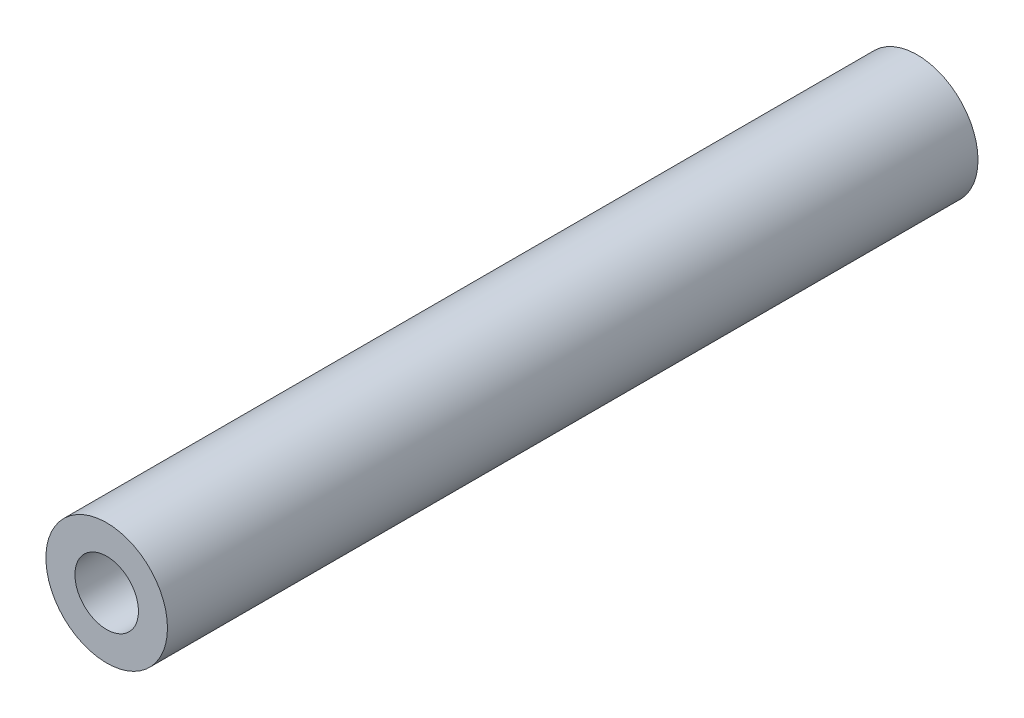
ISO-10303-21;
HEADER;
FILE_DESCRIPTION(('STEP AP214'),'2;1');
FILE_NAME('part.step','',(''),(''),'','','');
FILE_SCHEMA(('AUTOMOTIVE_DESIGN { 1 0 10303 214 1 1 1 1 }'));
ENDSEC;
DATA;
#1=APPLICATION_CONTEXT('core data for automotive mechanical design processes');
#2=APPLICATION_PROTOCOL_DEFINITION('international standard','automotive_design',2000,#1);
#3=PRODUCT_CONTEXT('',#1,'mechanical');
#4=PRODUCT('Part','Part','',(#3));
#5=PRODUCT_RELATED_PRODUCT_CATEGORY('part','',(#4));
#6=PRODUCT_DEFINITION_FORMATION('','',#4);
#7=PRODUCT_DEFINITION_CONTEXT('part definition',#1,'design');
#8=PRODUCT_DEFINITION('design','',#6,#7);
#9=PRODUCT_DEFINITION_SHAPE('','',#8);
#10=(LENGTH_UNIT() NAMED_UNIT(*) SI_UNIT(.MILLI.,.METRE.));
#11=(NAMED_UNIT(*) PLANE_ANGLE_UNIT() SI_UNIT($,.RADIAN.));
#12=(NAMED_UNIT(*) SI_UNIT($,.STERADIAN.) SOLID_ANGLE_UNIT());
#13=UNCERTAINTY_MEASURE_WITH_UNIT(LENGTH_MEASURE(1.E-05),#10,'distance_accuracy_value','');
#14=(GEOMETRIC_REPRESENTATION_CONTEXT(3) GLOBAL_UNCERTAINTY_ASSIGNED_CONTEXT((#13)) GLOBAL_UNIT_ASSIGNED_CONTEXT((#10,
#11,#12)) REPRESENTATION_CONTEXT('',''));
#15=CARTESIAN_POINT('',(0.,0.,0.));
#16=DIRECTION('',(0.,0.,1.));
#17=DIRECTION('',(1.,0.,0.));
#18=AXIS2_PLACEMENT_3D('',#15,#16,#17);
#19=CARTESIAN_POINT('',(0.,0.,31.75));
#20=DIRECTION('',(0.,0.,1.));
#21=DIRECTION('',(1.,0.,0.));
#22=AXIS2_PLACEMENT_3D('',#19,#20,#21);
#23=PLANE('',#22);
#24=CARTESIAN_POINT('',(0.,0.,31.75));
#25=DIRECTION('',(0.,0.,1.));
#26=DIRECTION('',(1.,0.,0.));
#27=AXIS2_PLACEMENT_3D('',#24,#25,#26);
#28=CIRCLE('',#27,4.7625);
#29=CARTESIAN_POINT('',(4.7625,0.,31.75));
#30=VERTEX_POINT('',#29);
#31=EDGE_CURVE('E11',#30,#30,#28,.T.);
#32=ORIENTED_EDGE('',*,*,#31,.T.);
#33=EDGE_LOOP('',(#32));
#34=FACE_BOUND('',#33,.T.);
#35=CARTESIAN_POINT('',(0.,0.,31.75));
#36=DIRECTION('',(0.,0.,1.));
#37=DIRECTION('',(1.,0.,0.));
#38=AXIS2_PLACEMENT_3D('',#35,#36,#37);
#39=CIRCLE('',#38,2.4892);
#40=CARTESIAN_POINT('',(2.4892,0.,31.75));
#41=VERTEX_POINT('',#40);
#42=EDGE_CURVE('E62',#41,#41,#39,.T.);
#43=ORIENTED_EDGE('',*,*,#42,.F.);
#44=EDGE_LOOP('',(#43));
#45=FACE_BOUND('',#44,.T.);
#46=ADVANCED_FACE('F49',(#34,#45),#23,.T.);
#47=CARTESIAN_POINT('',(0.,0.,-31.75));
#48=DIRECTION('',(0.,0.,1.));
#49=DIRECTION('',(1.,0.,0.));
#50=AXIS2_PLACEMENT_3D('',#47,#48,#49);
#51=PLANE('',#50);
#52=CARTESIAN_POINT('',(0.,0.,-31.75));
#53=DIRECTION('',(0.,0.,1.));
#54=DIRECTION('',(1.,0.,0.));
#55=AXIS2_PLACEMENT_3D('',#52,#53,#54);
#56=CIRCLE('',#55,4.7625);
#57=CARTESIAN_POINT('',(4.7625,0.,-31.75));
#58=VERTEX_POINT('',#57);
#59=EDGE_CURVE('E53',#58,#58,#56,.T.);
#60=ORIENTED_EDGE('',*,*,#59,.F.);
#61=EDGE_LOOP('',(#60));
#62=FACE_BOUND('',#61,.T.);
#63=CARTESIAN_POINT('',(0.,0.,-31.75));
#64=DIRECTION('',(0.,0.,1.));
#65=DIRECTION('',(1.,0.,0.));
#66=AXIS2_PLACEMENT_3D('',#63,#64,#65);
#67=CIRCLE('',#66,2.4892);
#68=CARTESIAN_POINT('',(2.4892,0.,-31.75));
#69=VERTEX_POINT('',#68);
#70=EDGE_CURVE('E64',#69,#69,#67,.T.);
#71=ORIENTED_EDGE('',*,*,#70,.T.);
#72=EDGE_LOOP('',(#71));
#73=FACE_BOUND('',#72,.T.);
#74=ADVANCED_FACE('F76',(#62,#73),#51,.F.);
#75=CARTESIAN_POINT('',(0.,0.,31.75));
#76=DIRECTION('',(0.,0.,-1.));
#77=DIRECTION('',(-1.,0.,0.));
#78=AXIS2_PLACEMENT_3D('',#75,#76,#77);
#79=CYLINDRICAL_SURFACE('',#78,4.7625);
#80=ORIENTED_EDGE('',*,*,#31,.F.);
#81=EDGE_LOOP('',(#80));
#82=FACE_BOUND('',#81,.T.);
#83=ORIENTED_EDGE('',*,*,#59,.T.);
#84=EDGE_LOOP('',(#83));
#85=FACE_BOUND('',#84,.T.);
#86=ADVANCED_FACE('F51',(#82,#85),#79,.T.);
#87=CARTESIAN_POINT('',(0.,0.,31.75));
#88=DIRECTION('',(0.,0.,-1.));
#89=DIRECTION('',(-1.,0.,0.));
#90=AXIS2_PLACEMENT_3D('',#87,#88,#89);
#91=CYLINDRICAL_SURFACE('',#90,2.4892);
#92=ORIENTED_EDGE('',*,*,#42,.T.);
#93=EDGE_LOOP('',(#92));
#94=FACE_BOUND('',#93,.T.);
#95=ORIENTED_EDGE('',*,*,#70,.F.);
#96=EDGE_LOOP('',(#95));
#97=FACE_BOUND('',#96,.T.);
#98=ADVANCED_FACE('F72',(#94,#97),#91,.F.);
#99=CLOSED_SHELL('',(#46,#74,#86,#98));
#100=MANIFOLD_SOLID_BREP('B2',#99);
#101=ADVANCED_BREP_SHAPE_REPRESENTATION('',(#18,#100),#14);
#102=SHAPE_DEFINITION_REPRESENTATION(#9,#101);
ENDSEC;
END-ISO-10303-21;
